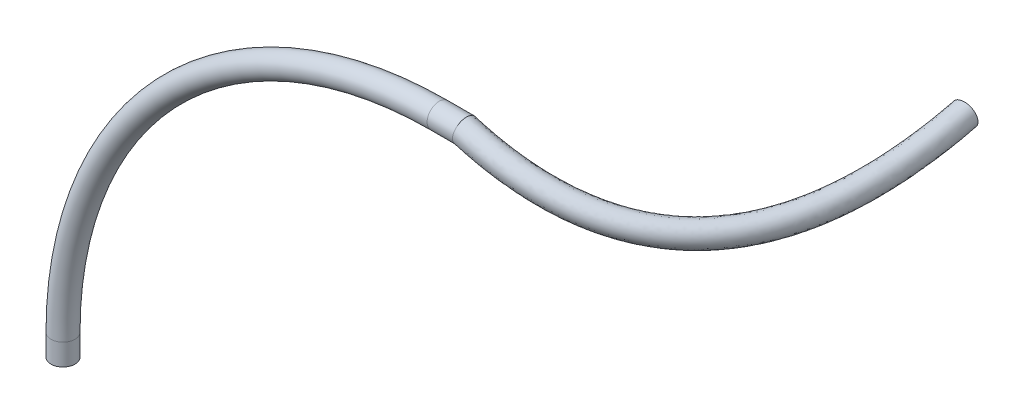
ISO-10303-21;
HEADER;
FILE_DESCRIPTION(('STEP AP214'),'2;1');
FILE_NAME('part.step','',(''),(''),'','','');
FILE_SCHEMA(('AUTOMOTIVE_DESIGN { 1 0 10303 214 1 1 1 1 }'));
ENDSEC;
DATA;
#1=APPLICATION_CONTEXT('core data for automotive mechanical design processes');
#2=APPLICATION_PROTOCOL_DEFINITION('international standard','automotive_design',2000,#1);
#3=PRODUCT_CONTEXT('',#1,'mechanical');
#4=PRODUCT('Part','Part','',(#3));
#5=PRODUCT_RELATED_PRODUCT_CATEGORY('part','',(#4));
#6=PRODUCT_DEFINITION_FORMATION('','',#4);
#7=PRODUCT_DEFINITION_CONTEXT('part definition',#1,'design');
#8=PRODUCT_DEFINITION('design','',#6,#7);
#9=PRODUCT_DEFINITION_SHAPE('','',#8);
#10=(LENGTH_UNIT() NAMED_UNIT(*) SI_UNIT(.MILLI.,.METRE.));
#11=(NAMED_UNIT(*) PLANE_ANGLE_UNIT() SI_UNIT($,.RADIAN.));
#12=(NAMED_UNIT(*) SI_UNIT($,.STERADIAN.) SOLID_ANGLE_UNIT());
#13=UNCERTAINTY_MEASURE_WITH_UNIT(LENGTH_MEASURE(1.E-05),#10,'distance_accuracy_value','');
#14=(GEOMETRIC_REPRESENTATION_CONTEXT(3) GLOBAL_UNCERTAINTY_ASSIGNED_CONTEXT((#13)) GLOBAL_UNIT_ASSIGNED_CONTEXT((#10,
#11,#12)) REPRESENTATION_CONTEXT('',''));
#15=CARTESIAN_POINT('',(0.,0.,0.));
#16=DIRECTION('',(0.,0.,1.));
#17=DIRECTION('',(1.,0.,0.));
#18=AXIS2_PLACEMENT_3D('',#15,#16,#17);
#19=CARTESIAN_POINT('',(14.678622137143,9.83327472996961,-7.76162424087766));
#20=DIRECTION('',(-0.0700027178041143,0.155686523829591,-0.985322955075084));
#21=DIRECTION('',(0.981410299502841,-0.166195071340584,-0.0959844898504047));
#22=AXIS2_PLACEMENT_3D('',#19,#20,#21);
#23=PLANE('',#22);
#24=CARTESIAN_POINT('',(14.678622137143,9.83327472996961,-7.76162424087766));
#25=DIRECTION('',(-0.0700027178041143,0.155686523829591,-0.985322955075084));
#26=DIRECTION('',(0.981410299502841,-0.166195071340584,-0.0959844898504047));
#27=AXIS2_PLACEMENT_3D('',#24,#25,#26);
#28=CIRCLE('',#27,0.32);
#29=CARTESIAN_POINT('',(14.9926734329839,9.78009230714062,-7.79233927762978));
#30=VERTEX_POINT('',#29);
#31=EDGE_CURVE('E36',#30,#30,#28,.T.);
#32=ORIENTED_EDGE('',*,*,#31,.T.);
#33=EDGE_LOOP('',(#32));
#34=FACE_BOUND('',#33,.T.);
#35=ADVANCED_FACE('F33',(#34),#23,.T.);
#36=CARTESIAN_POINT('',(-1.54134880342802,0.,0.));
#37=DIRECTION('',(0.,1.,0.));
#38=DIRECTION('',(0.,0.,1.));
#39=AXIS2_PLACEMENT_3D('',#36,#37,#38);
#40=PLANE('',#39);
#41=CARTESIAN_POINT('',(-1.54134880342802,0.,0.));
#42=DIRECTION('',(0.,1.,0.));
#43=DIRECTION('',(0.,0.,1.));
#44=AXIS2_PLACEMENT_3D('',#41,#42,#43);
#45=CIRCLE('',#44,0.32);
#46=CARTESIAN_POINT('',(-1.54134880342802,0.,0.32));
#47=VERTEX_POINT('',#46);
#48=EDGE_CURVE('E91',#47,#47,#45,.T.);
#49=ORIENTED_EDGE('',*,*,#48,.F.);
#50=EDGE_LOOP('',(#49));
#51=FACE_BOUND('',#50,.T.);
#52=ADVANCED_FACE('F85',(#51),#40,.F.);
#53=CARTESIAN_POINT('',(8.93593759161332,10.6369732274452,0.322841538927934));
#54=CARTESIAN_POINT('',(9.00338743391825,10.6153510667797,0.321884383423131));
#55=CARTESIAN_POINT('',(9.06982495986169,10.5940531894127,0.320943306387572));
#56=CARTESIAN_POINT('',(10.1685117511153,10.241854711181,0.305324761297576));
#57=CARTESIAN_POINT('',(11.1012604423589,9.96506398545277,0.127631337626633));
#58=CARTESIAN_POINT('',(12.6716876938876,9.55359951845456,-0.575376471656913));
#59=CARTESIAN_POINT('',(13.3223448371257,9.41518863167212,-1.10400878811768));
#60=CARTESIAN_POINT('',(14.8080876768466,9.21703057310009,-3.18380808573489));
#61=CARTESIAN_POINT('',(15.1774603219235,9.36912500117508,-5.1913722170686));
#62=CARTESIAN_POINT('',(14.9926734329839,9.78009230714062,-7.79233927762978));
#63=CARTESIAN_POINT('',(8.74058579712073,10.0275178573528,0.32419366839873));
#64=CARTESIAN_POINT('',(8.80803563942566,10.0058956966873,0.32323651289393));
#65=CARTESIAN_POINT('',(8.87420810011658,9.98468278859777,0.322299210372553));
#66=CARTESIAN_POINT('',(9.9771486820398,9.63112071586985,0.306620091544329));
#67=CARTESIAN_POINT('',(10.9245317993321,9.34979484199555,0.127563074496907));
#68=CARTESIAN_POINT('',(12.519375357415,8.93193310796831,-0.586374788877517));
#69=CARTESIAN_POINT('',(13.1832022316963,8.79068564885186,-1.12544756664846));
#70=CARTESIAN_POINT('',(14.6949816990514,8.5890550056674,-3.24169392453752));
#71=CARTESIAN_POINT('',(15.0638834727551,8.74418228419991,-5.27058387112157));
#72=CARTESIAN_POINT('',(14.8783058743416,9.15690813331417,-7.88268055846221));
#73=CARTESIAN_POINT('',(8.73193809311171,10.0288699868236,-0.315746476428321));
#74=CARTESIAN_POINT('',(8.79938793541673,10.0072478261583,-0.316703631933121));
#75=CARTESIAN_POINT('',(8.86758790139285,9.9853849812799,-0.317669806014922));
#76=CARTESIAN_POINT('',(9.93799089876498,9.64225315175161,-0.332885591482085));
#77=CARTESIAN_POINT('',(10.7734341224581,9.39561698823871,-0.501512373891961));
#78=CARTESIAN_POINT('',(12.1815154017455,9.02668846062532,-1.13184538061663));
#79=CARTESIAN_POINT('',(12.7446059515001,8.90713816982707,-1.59105823601819));
#80=CARTESIAN_POINT('',(14.05722917472,8.73206960367635,-3.42851811911233));
#81=CARTESIAN_POINT('',(14.4297326811182,8.86399836683104,-5.29428520170494));
#82=CARTESIAN_POINT('',(14.2502032826598,9.26327297897214,-7.82125048495795));
#83=CARTESIAN_POINT('',(8.9272898876043,10.638325356916,-0.317098605899117));
#84=CARTESIAN_POINT('',(8.99473972990923,10.6167031962505,-0.31805576140392));
#85=CARTESIAN_POINT('',(9.06320476113796,10.5947553820949,-0.319025709999902));
#86=CARTESIAN_POINT('',(10.1293539678405,10.2529871470622,-0.334180921728839));
#87=CARTESIAN_POINT('',(10.9501627654849,10.0108861316959,-0.501444110762202));
#88=CARTESIAN_POINT('',(12.3338277382181,9.64835487111157,-1.12084706339606));
#89=CARTESIAN_POINT('',(12.8837485569295,9.53164115264698,-1.56961945748749));
#90=CARTESIAN_POINT('',(14.1703351525152,9.36004517110973,-3.37063228030952));
#91=CARTESIAN_POINT('',(14.5433095302821,9.48894108380283,-5.21507354765366));
#92=CARTESIAN_POINT('',(14.3645708413021,9.88645715279859,-7.73090920412552));
#93=CARTESIAN_POINT('',(9.12264168209689,11.2477807270083,-0.318450735369914));
#94=CARTESIAN_POINT('',(9.19009152440173,11.2261585663427,-0.319407890874719));
#95=CARTESIAN_POINT('',(9.25882162088306,11.2041257829099,-0.320381613984883));
#96=CARTESIAN_POINT('',(10.320717036916,10.8637211423729,-0.335476251975592));
#97=CARTESIAN_POINT('',(11.1268914085117,10.6261552751532,-0.501375847632442));
#98=CARTESIAN_POINT('',(12.4861400746906,10.2700212815978,-1.10984874617549));
#99=CARTESIAN_POINT('',(13.022891162359,10.1561441354669,-1.54818067895679));
#100=CARTESIAN_POINT('',(14.2834411303103,9.98802073854312,-3.31274644150671));
#101=CARTESIAN_POINT('',(14.6568863794459,10.1138838007746,-5.13586189360237));
#102=CARTESIAN_POINT('',(14.4789383999444,10.509641326625,-7.6405679232931));
#103=CARTESIAN_POINT('',(9.13128938610592,11.2464285975375,0.321489409457137));
#104=CARTESIAN_POINT('',(9.19873922841085,11.2248064368721,0.320532253952331));
#105=CARTESIAN_POINT('',(9.26544181960679,11.2034235902277,0.319587402402592));
#106=CARTESIAN_POINT('',(10.3598748201908,10.8525887064921,0.304029431050823));
#107=CARTESIAN_POINT('',(11.2779890853858,10.58033312891,0.127699600756358));
#108=CARTESIAN_POINT('',(12.8240000303601,10.1752659289408,-0.564378154436309));
#109=CARTESIAN_POINT('',(13.4614874425552,10.0396916144924,-1.08257000958689));
#110=CARTESIAN_POINT('',(14.9211936546417,9.84500614053279,-3.12592224693225));
#111=CARTESIAN_POINT('',(15.2910371710918,9.99406771815024,-5.11216056301562));
#112=CARTESIAN_POINT('',(15.1070409916262,10.4032764809671,-7.70199799679736));
#113=CARTESIAN_POINT('',(8.93593759161332,10.6369732274452,0.322841538927934));
#114=CARTESIAN_POINT('',(9.00338743391825,10.6153510667797,0.321884383423131));
#115=CARTESIAN_POINT('',(9.06982495986169,10.5940531894127,0.320943306387572));
#116=CARTESIAN_POINT('',(10.1685117511153,10.241854711181,0.305324761297576));
#117=CARTESIAN_POINT('',(11.1012604423589,9.96506398545277,0.127631337626633));
#118=CARTESIAN_POINT('',(12.6716876938876,9.55359951845456,-0.575376471656913));
#119=CARTESIAN_POINT('',(13.3223448371257,9.41518863167212,-1.10400878811768));
#120=CARTESIAN_POINT('',(14.8080876768466,9.21703057310009,-3.18380808573489));
#121=CARTESIAN_POINT('',(15.1774603219235,9.36912500117508,-5.1913722170686));
#122=CARTESIAN_POINT('',(14.9926734329839,9.78009230714062,-7.79233927762978));
#123=(BOUNDED_SURFACE() B_SPLINE_SURFACE(3,3,((#53,#54,#55,#56,#57,#58,#59,#60,#61,#62),(#63,
#64,#65,#66,#67,#68,#69,#70,#71,#72),(#73,#74,#75,#76,#77,#78,#79,#80,#81,#82),(#83,#84,#85,#86,
#87,#88,#89,#90,#91,#92),(#93,#94,#95,#96,#97,#98,#99,#100,#101,#102),(#103,#104,#105,#106,#107,
#108,#109,#110,#111,#112),(#113,#114,#115,#116,#117,#118,#119,#120,#121,#122)),.UNSPECIFIED.,
.T.,.F.,.F.) B_SPLINE_SURFACE_WITH_KNOTS((4,3,4),(4,2,2,2,4),(0.,0.5,1.),(-0.0166134055866253,
0.,0.25,0.5,1.),.UNSPECIFIED.) GEOMETRIC_REPRESENTATION_ITEM() RATIONAL_B_SPLINE_SURFACE(((1.,
1.,1.,1.,1.,1.,1.,1.,1.,1.),(0.333333333333333,0.333333333333333,0.333333333333333,
0.333333333333333,0.333333333333333,0.333333333333333,0.333333333333333,0.333333333333333,
0.333333333333333,0.333333333333333),(0.333333333333333,0.333333333333333,0.333333333333333,
0.333333333333333,0.333333333333333,0.333333333333333,0.333333333333333,0.333333333333333,
0.333333333333333,0.333333333333333),(1.,1.,1.,1.,1.,1.,1.,1.,1.,1.),(0.333333333333333,
0.333333333333333,0.333333333333333,0.333333333333333,0.333333333333333,0.333333333333333,
0.333333333333333,0.333333333333333,0.333333333333333,0.333333333333333),(0.333333333333333,
0.333333333333333,0.333333333333333,0.333333333333333,0.333333333333333,0.333333333333333,
0.333333333333333,0.333333333333333,0.333333333333333,0.333333333333333),(1.,1.,1.,1.,1.,1.,1.,
1.,1.,1.))) REPRESENTATION_ITEM('') SURFACE());
#124=CARTESIAN_POINT('',(9.13396326647531,10.5869588054316,-0.319685847561491));
#125=CARTESIAN_POINT('',(9.13429686073061,10.5890881432866,-0.319591533881282));
#126=CARTESIAN_POINT('',(9.13463053010294,10.59121700498,-0.31947579514627));
#127=CARTESIAN_POINT('',(9.13779818263134,10.6114180663033,-0.318174217301117));
#128=CARTESIAN_POINT('',(9.14063218507179,10.6294225971134,-0.315468525121818));
#129=CARTESIAN_POINT('',(9.14621576562466,10.6647581568378,-0.307037336269129));
#130=CARTESIAN_POINT('',(9.14896510499654,10.6820873123219,-0.301304003986558));
#131=CARTESIAN_POINT('',(9.15429159348689,10.7155176599907,-0.286978383234807));
#132=CARTESIAN_POINT('',(9.15686903497437,10.7316209441337,-0.278391105862315));
#133=CARTESIAN_POINT('',(9.1617851132281,10.762183158689,-0.258572543018122));
#134=CARTESIAN_POINT('',(9.16412340463465,10.7766397143705,-0.247337509090666));
#135=CARTESIAN_POINT('',(9.16847194670618,10.8033558247696,-0.22263128098669));
#136=CARTESIAN_POINT('',(9.17048445807791,10.8156305838026,-0.20917693289718));
#137=CARTESIAN_POINT('',(9.17414413151744,10.8377577206157,-0.180330604952662));
#138=CARTESIAN_POINT('',(9.17579079806696,10.8476068148905,-0.164936040846286));
#139=CARTESIAN_POINT('',(9.1786459802884,10.864446518724,-0.132875520275447));
#140=CARTESIAN_POINT('',(9.1798599053143,10.8714725693138,-0.116228658419127));
#141=CARTESIAN_POINT('',(9.18184337238376,10.882638699921,-0.0819434729429584));
#142=CARTESIAN_POINT('',(9.18261234060826,10.8867750547868,-0.0643039011237629));
#143=CARTESIAN_POINT('',(9.18367353006307,10.8919872383032,-0.0287660375900349));
#144=CARTESIAN_POINT('',(9.18397097477523,10.8930966992337,-0.0108728283561199));
#145=CARTESIAN_POINT('',(9.18409645538643,10.8923162861257,0.0248495774204809));
#146=CARTESIAN_POINT('',(9.18392450395694,10.8904264930532,0.0426787756781464));
#147=CARTESIAN_POINT('',(9.18311814205,10.8837177734969,0.0776910321591958));
#148=CARTESIAN_POINT('',(9.18248560540324,10.8789107286295,0.0948764126979505));
#149=CARTESIAN_POINT('',(9.18078050016678,10.8665299862749,0.128170379352268));
#150=CARTESIAN_POINT('',(9.17970850391135,10.8589598886759,0.144280334443318));
#151=CARTESIAN_POINT('',(9.17715077473671,10.8412368706741,0.175069482772692));
#152=CARTESIAN_POINT('',(9.17566323500075,10.831072688039,0.189742041034662));
#153=CARTESIAN_POINT('',(9.17232256586339,10.8084916211744,0.217155115280554));
#154=CARTESIAN_POINT('',(9.1704699086985,10.7960776484347,0.229898089698428));
#155=CARTESIAN_POINT('',(9.1664043365412,10.7690331786651,0.253405113773774));
#156=CARTESIAN_POINT('',(9.16418407860018,10.7543580467849,0.264116560811504));
#157=CARTESIAN_POINT('',(9.15948358906253,10.7234627121156,0.282881175546831));
#158=CARTESIAN_POINT('',(9.15700371048754,10.7072446100657,0.290937892732812));
#159=CARTESIAN_POINT('',(9.15184914439152,10.6736883988096,0.304210991037748));
#160=CARTESIAN_POINT('',(9.14917416538143,10.6563486183225,0.30942301926529));
#161=CARTESIAN_POINT('',(9.14371235677761,10.6210861647569,0.316844118466009));
#162=CARTESIAN_POINT('',(9.14092579598377,10.6031649101455,0.319060006084428));
#163=CARTESIAN_POINT('',(9.13708282080762,10.5785439776215,0.320017968890589));
#164=CARTESIAN_POINT('',(9.13604023789091,10.5718738609765,0.320068227467657));
#165=CARTESIAN_POINT('',(9.1346525564234,10.5630069719859,0.319858199434647));
#166=CARTESIAN_POINT('',(9.1343079083598,10.5608056759257,0.319783329902979));
#167=CARTESIAN_POINT('',(9.13396326657919,10.5586052874727,0.319685779820604));
#168=B_SPLINE_CURVE_WITH_KNOTS('',3,(#124,#125,#126,#127,#128,#129,#130,#131,#132,#133,#134,
#135,#136,#137,#138,#139,#140,#141,#142,#143,#144,#145,#146,#147,#148,#149,#150,#151,#152,#153,
#154,#155,#156,#157,#158,#159,#160,#161,#162,#163,#164,#165,#166,#167),.UNSPECIFIED.,.F.,.F.,(4,
2,2,2,2,2,2,2,2,2,2,2,2,2,2,2,2,2,2,2,2,4),(0.,0.00647339059284194,0.0614543530802732,
0.116578310116963,0.17160598470852,0.226712035541182,0.281417571075208,0.336196756788152,
0.390264965939966,0.444402747277668,0.497936497398626,0.55146880237909,0.604784526444373,
0.658031033769727,0.711512764692407,0.764925771948849,0.819574484882482,0.874149830803396,
0.928808454455863,0.983342511543432,1.00358645053541,1.01027420190747),.UNSPECIFIED.);
#169=CARTESIAN_POINT('',(9.13396326657919,10.5586052874727,0.319685779820604));
#170=VERTEX_POINT('',#169);
#171=CARTESIAN_POINT('',(9.13396326647531,10.5869588054316,-0.319685847561491));
#172=VERTEX_POINT('',#171);
#173=EDGE_CURVE('E11',#170,#172,#168,.F.);
#174=CARTESIAN_POINT('',(9.13396326647531,10.5869588054316,-0.319685847561491));
#175=CARTESIAN_POINT('',(9.13362724063041,10.5848298573234,-0.319780360859648));
#176=CARTESIAN_POINT('',(9.13329113618911,10.5826994881804,-0.319853499098134));
#177=CARTESIAN_POINT('',(9.13009977598375,10.5624624246386,-0.320345163565144));
#178=CARTESIAN_POINT('',(9.12724445442105,10.5442885999347,-0.319243741575365));
#179=CARTESIAN_POINT('',(9.12162161272775,10.5083439233464,-0.313973002398967));
#180=CARTESIAN_POINT('',(9.11885434022158,10.4905742422341,-0.309795714975282));
#181=CARTESIAN_POINT('',(9.11349714572635,10.4560040750082,-0.29848387141355));
#182=CARTESIAN_POINT('',(9.11090692445102,10.4392019613015,-0.291354457174146));
#183=CARTESIAN_POINT('',(9.10597204088297,10.4070012121458,-0.274315169241842));
#184=CARTESIAN_POINT('',(9.10362773319426,10.3916046074597,-0.264401354171183));
#185=CARTESIAN_POINT('',(9.09927528705942,10.3628055177318,-0.242153082942051));
#186=CARTESIAN_POINT('',(9.09726475714299,10.3493889307365,-0.229837356899967));
#187=CARTESIAN_POINT('',(9.09361633748399,10.3247968930261,-0.203061115984962));
#188=CARTESIAN_POINT('',(9.09197895231126,10.3136244792942,-0.188597740149129));
#189=CARTESIAN_POINT('',(9.0891489655957,10.2940174338236,-0.158155980650593));
#190=CARTESIAN_POINT('',(9.08795074947672,10.2855484352728,-0.142200251017066));
#191=CARTESIAN_POINT('',(9.08600300354142,10.2713959344466,-0.109046686653368));
#192=CARTESIAN_POINT('',(9.08525405284443,10.2657160291153,-0.0918472806255916));
#193=CARTESIAN_POINT('',(9.08423467806786,10.2573801625582,-0.0569204916842644));
#194=CARTESIAN_POINT('',(9.08395901208592,10.2546911939961,-0.0392011328848397));
#195=CARTESIAN_POINT('',(9.08387658177974,10.2523046278609,-0.00356114525281095));
#196=CARTESIAN_POINT('',(9.08406980609547,10.2526069578167,0.0143594786931769));
#197=CARTESIAN_POINT('',(9.08491579912086,10.2561849573744,0.0498219261604067));
#198=CARTESIAN_POINT('',(9.08556684467432,10.2594494911133,0.0673649166615268));
#199=CARTESIAN_POINT('',(9.08730417750655,10.2688294061902,0.101623550442432));
#200=CARTESIAN_POINT('',(9.08838989952178,10.2749410867132,0.118340236671895));
#201=CARTESIAN_POINT('',(9.09096924975022,10.2898660579245,0.150582800330092));
#202=CARTESIAN_POINT('',(9.09246478198868,10.29869198331,0.166102674897207));
#203=CARTESIAN_POINT('',(9.09581452130065,10.3187605553171,0.195417135480234));
#204=CARTESIAN_POINT('',(9.09766826460915,10.3300000791975,0.209213914717225));
#205=CARTESIAN_POINT('',(9.1017285119771,10.3548610032077,0.235028690165514));
#206=CARTESIAN_POINT('',(9.10394211466886,10.3685310021351,0.246998784257317));
#207=CARTESIAN_POINT('',(9.10862276128861,10.3976466103369,0.268427971095726));
#208=CARTESIAN_POINT('',(9.11108946030508,10.4130898064861,0.277890419758267));
#209=CARTESIAN_POINT('',(9.11621268675117,10.4453447128669,0.294084870155242));
#210=CARTESIAN_POINT('',(9.11886950014819,10.4621584902278,0.300812652409208));
#211=CARTESIAN_POINT('',(9.12429216902932,10.4966333207799,0.311327485161987));
#212=CARTESIAN_POINT('',(9.12705776193025,10.5142923535873,0.315121209303525));
#213=CARTESIAN_POINT('',(9.13087007071516,10.5387289135381,0.318252927005493));
#214=CARTESIAN_POINT('',(9.13190328508329,10.5453610946961,0.318892533269683));
#215=CARTESIAN_POINT('',(9.13327913549276,10.5542048197162,0.319467830621251));
#216=CARTESIAN_POINT('',(9.133621192641,10.556404503075,0.319588145340755));
#217=CARTESIAN_POINT('',(9.13396326657919,10.5586052874727,0.319685779820604));
#218=B_SPLINE_CURVE_WITH_KNOTS('',3,(#174,#175,#176,#177,#178,#179,#180,#181,#182,#183,#184,
#185,#186,#187,#188,#189,#190,#191,#192,#193,#194,#195,#196,#197,#198,#199,#200,#201,#202,#203,
#204,#205,#206,#207,#208,#209,#210,#211,#212,#213,#214,#215,#216,#217),.UNSPECIFIED.,.F.,.F.,(4,
2,2,2,2,2,2,2,2,2,2,2,2,2,2,2,2,2,2,2,2,4),(0.,0.00647339457098778,0.0614656471617476,
0.116600900354401,0.171640522401596,0.226758450287497,0.281462614963081,0.336240317917712,
0.390291034860959,0.444411276235791,0.497928142309032,0.551443711816785,0.604758929078599,
0.658005038010717,0.711502856376786,0.764931871256677,0.819582921377994,0.874160459810781,
0.928821892419525,0.983358626560096,1.00357648046489,1.0102642275071),.UNSPECIFIED.);
#219=EDGE_CURVE('E41',#170,#172,#218,.F.);
#220=ORIENTED_EDGE('',*,*,#173,.F.);
#221=ORIENTED_EDGE('',*,*,#219,.T.);
#222=EDGE_LOOP('',(#220,#221));
#223=FACE_BOUND('',#222,.T.);
#224=ORIENTED_EDGE('',*,*,#31,.F.);
#225=EDGE_LOOP('',(#224));
#226=FACE_BOUND('',#225,.T.);
#227=ADVANCED_FACE('F48',(#223,#226),#123,.T.);
#228=CARTESIAN_POINT('',(-1.54134880342802,0.,0.));
#229=DIRECTION('',(0.,1.,0.));
#230=DIRECTION('',(0.,0.,1.));
#231=AXIS2_PLACEMENT_3D('',#228,#229,#230);
#232=CYLINDRICAL_SURFACE('',#231,0.32);
#233=CARTESIAN_POINT('',(-1.54134880342802,0.572782810183749,0.));
#234=DIRECTION('',(0.,1.,0.));
#235=DIRECTION('',(0.,0.,1.));
#236=AXIS2_PLACEMENT_3D('',#233,#234,#235);
#237=CIRCLE('',#236,0.32);
#238=CARTESIAN_POINT('',(-1.86134880342802,0.572782810183749,0.));
#239=VERTEX_POINT('',#238);
#240=EDGE_CURVE('E55',#239,#239,#237,.T.);
#241=ORIENTED_EDGE('',*,*,#240,.F.);
#242=EDGE_LOOP('',(#241));
#243=FACE_BOUND('',#242,.T.);
#244=ORIENTED_EDGE('',*,*,#48,.T.);
#245=EDGE_LOOP('',(#244));
#246=FACE_BOUND('',#245,.T.);
#247=ADVANCED_FACE('F78',(#243,#246),#232,.T.);
#248=CARTESIAN_POINT('',(8.45865119657198,0.572782810183749,0.));
#249=DIRECTION('',(0.,0.,-1.));
#250=DIRECTION('',(0.,1.,0.));
#251=AXIS2_PLACEMENT_3D('',#248,#249,#250);
#252=TOROIDAL_SURFACE('',#251,10.,0.32);
#253=CARTESIAN_POINT('',(8.45865119657198,10.5727828101837,0.));
#254=DIRECTION('',(1.,0.,0.));
#255=DIRECTION('',(0.,0.,1.));
#256=AXIS2_PLACEMENT_3D('',#253,#254,#255);
#257=CIRCLE('',#256,0.32);
#258=CARTESIAN_POINT('',(8.45865119657198,10.8927828101837,0.));
#259=VERTEX_POINT('',#258);
#260=EDGE_CURVE('E53',#259,#259,#257,.T.);
#261=CARTESIAN_POINT('',(8.45865119657198,0.572782810183749,0.));
#262=DIRECTION('',(0.,0.,-1.));
#263=DIRECTION('',(0.,1.,0.));
#264=AXIS2_PLACEMENT_3D('',#261,#262,#263);
#265=CIRCLE('',#264,10.32);
#266=EDGE_CURVE('',#239,#259,#265,.T.);
#267=ORIENTED_EDGE('',*,*,#240,.T.);
#268=ORIENTED_EDGE('',*,*,#260,.F.);
#269=ORIENTED_EDGE('',*,*,#266,.T.);
#270=ORIENTED_EDGE('',*,*,#266,.F.);
#271=EDGE_LOOP('',(#267,#269,#268,#270));
#272=FACE_BOUND('',#271,.T.);
#273=ADVANCED_FACE('F74',(#272),#252,.T.);
#274=CARTESIAN_POINT('',(8.45865119657198,10.5727828101837,0.));
#275=DIRECTION('',(1.,0.,0.));
#276=DIRECTION('',(0.,0.,-1.));
#277=AXIS2_PLACEMENT_3D('',#274,#275,#276);
#278=CYLINDRICAL_SURFACE('',#277,0.32);
#279=ORIENTED_EDGE('',*,*,#219,.F.);
#280=ORIENTED_EDGE('',*,*,#173,.T.);
#281=EDGE_LOOP('',(#279,#280));
#282=FACE_BOUND('',#281,.T.);
#283=ORIENTED_EDGE('',*,*,#260,.T.);
#284=EDGE_LOOP('',(#283));
#285=FACE_BOUND('',#284,.T.);
#286=ADVANCED_FACE('F51',(#282,#285),#278,.T.);
#287=CLOSED_SHELL('',(#35,#52,#227,#247,#273,#286));
#288=MANIFOLD_SOLID_BREP('B2',#287);
#289=ADVANCED_BREP_SHAPE_REPRESENTATION('',(#18,#288),#14);
#290=SHAPE_DEFINITION_REPRESENTATION(#9,#289);
ENDSEC;
END-ISO-10303-21;
